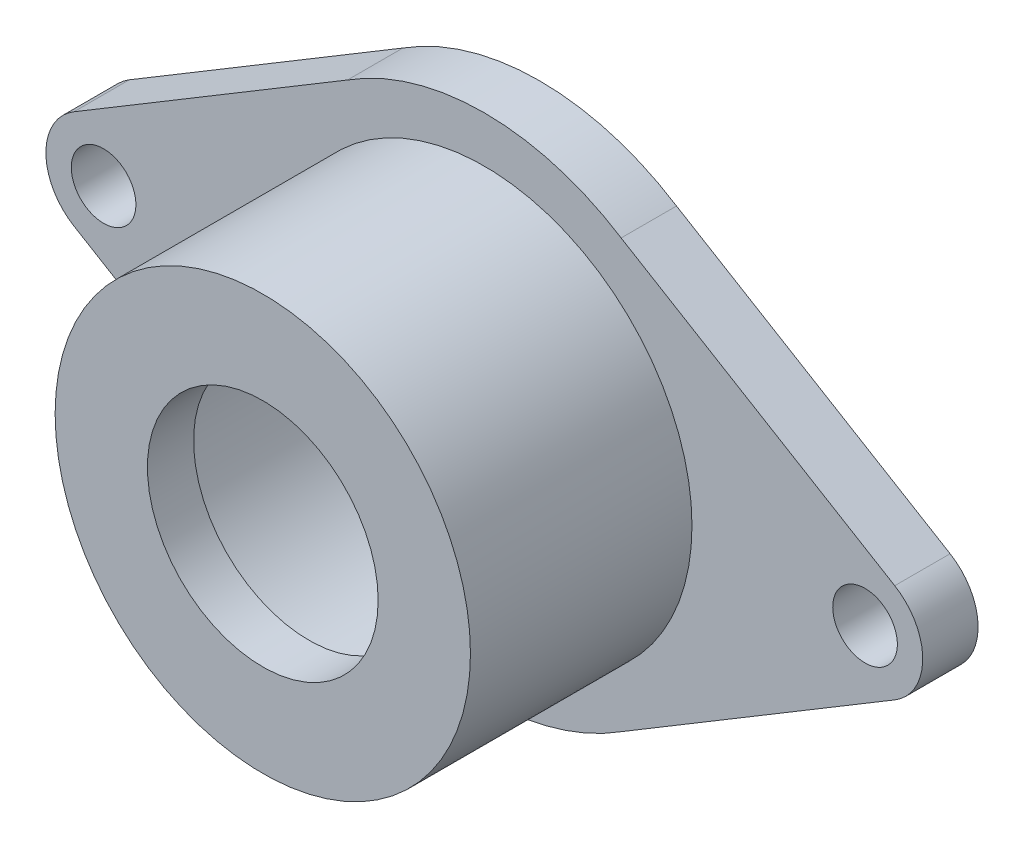
ISO-10303-21;
HEADER;
FILE_DESCRIPTION(('STEP AP214'),'2;1');
FILE_NAME('part.step','',(''),(''),'','','');
FILE_SCHEMA(('AUTOMOTIVE_DESIGN { 1 0 10303 214 1 1 1 1 }'));
ENDSEC;
DATA;
#1=APPLICATION_CONTEXT('core data for automotive mechanical design processes');
#2=APPLICATION_PROTOCOL_DEFINITION('international standard','automotive_design',2000,#1);
#3=PRODUCT_CONTEXT('',#1,'mechanical');
#4=PRODUCT('Part','Part','',(#3));
#5=PRODUCT_RELATED_PRODUCT_CATEGORY('part','',(#4));
#6=PRODUCT_DEFINITION_FORMATION('','',#4);
#7=PRODUCT_DEFINITION_CONTEXT('part definition',#1,'design');
#8=PRODUCT_DEFINITION('design','',#6,#7);
#9=PRODUCT_DEFINITION_SHAPE('','',#8);
#10=(LENGTH_UNIT() NAMED_UNIT(*) SI_UNIT(.MILLI.,.METRE.));
#11=(NAMED_UNIT(*) PLANE_ANGLE_UNIT() SI_UNIT($,.RADIAN.));
#12=(NAMED_UNIT(*) SI_UNIT($,.STERADIAN.) SOLID_ANGLE_UNIT());
#13=UNCERTAINTY_MEASURE_WITH_UNIT(LENGTH_MEASURE(1.E-05),#10,'distance_accuracy_value','');
#14=(GEOMETRIC_REPRESENTATION_CONTEXT(3) GLOBAL_UNCERTAINTY_ASSIGNED_CONTEXT((#13)) GLOBAL_UNIT_ASSIGNED_CONTEXT((#10,
#11,#12)) REPRESENTATION_CONTEXT('',''));
#15=CARTESIAN_POINT('',(0.,0.,0.));
#16=DIRECTION('',(0.,0.,1.));
#17=DIRECTION('',(1.,0.,0.));
#18=AXIS2_PLACEMENT_3D('',#15,#16,#17);
#19=CARTESIAN_POINT('',(0.,-43.5096153846154,119.471153846154));
#20=DIRECTION('',(0.,0.,1.));
#21=DIRECTION('',(1.,0.,0.));
#22=AXIS2_PLACEMENT_3D('',#19,#20,#21);
#23=CYLINDRICAL_SURFACE('',#22,45.);
#24=CARTESIAN_POINT('',(0.,-43.5096153846154,119.471153846154));
#25=DIRECTION('',(0.,0.,1.));
#26=DIRECTION('',(1.,0.,0.));
#27=AXIS2_PLACEMENT_3D('',#24,#25,#26);
#28=CIRCLE('',#27,45.);
#29=CARTESIAN_POINT('',(45.,-43.5096153846154,119.471153846154));
#30=VERTEX_POINT('',#29);
#31=EDGE_CURVE('E177',#30,#30,#28,.T.);
#32=ORIENTED_EDGE('',*,*,#31,.F.);
#33=EDGE_LOOP('',(#32));
#34=FACE_BOUND('',#33,.T.);
#35=CARTESIAN_POINT('',(0.,-43.5096153846154,71.471153846154));
#36=DIRECTION('',(0.,0.,-1.));
#37=DIRECTION('',(-1.,0.,0.));
#38=AXIS2_PLACEMENT_3D('',#35,#36,#37);
#39=CIRCLE('',#38,45.);
#40=CARTESIAN_POINT('',(-45.,-43.5096153846154,71.471153846154));
#41=VERTEX_POINT('',#40);
#42=EDGE_CURVE('E11',#41,#41,#39,.T.);
#43=ORIENTED_EDGE('',*,*,#42,.F.);
#44=EDGE_LOOP('',(#43));
#45=FACE_BOUND('',#44,.T.);
#46=ADVANCED_FACE('F35',(#34,#45),#23,.T.);
#47=CARTESIAN_POINT('',(0.,-43.5096153846154,119.471153846154));
#48=DIRECTION('',(0.,0.,1.));
#49=DIRECTION('',(1.,0.,0.));
#50=AXIS2_PLACEMENT_3D('',#47,#48,#49);
#51=CYLINDRICAL_SURFACE('',#50,35.);
#52=CARTESIAN_POINT('',(0.,-43.5096153846154,59.471153846154));
#53=DIRECTION('',(0.,0.,1.));
#54=DIRECTION('',(1.,0.,0.));
#55=AXIS2_PLACEMENT_3D('',#52,#53,#54);
#56=CIRCLE('',#55,35.);
#57=CARTESIAN_POINT('',(35.,-43.5096153846154,59.471153846154));
#58=VERTEX_POINT('',#57);
#59=EDGE_CURVE('E44',#58,#58,#56,.T.);
#60=ORIENTED_EDGE('',*,*,#59,.F.);
#61=EDGE_LOOP('',(#60));
#62=FACE_BOUND('',#61,.T.);
#63=CARTESIAN_POINT('',(0.,-43.5096153846154,109.471153846154));
#64=DIRECTION('',(0.,0.,1.));
#65=DIRECTION('',(1.,0.,0.));
#66=AXIS2_PLACEMENT_3D('',#63,#64,#65);
#67=CIRCLE('',#66,35.);
#68=CARTESIAN_POINT('',(35.,-43.5096153846154,109.471153846154));
#69=VERTEX_POINT('',#68);
#70=EDGE_CURVE('E159',#69,#69,#67,.T.);
#71=ORIENTED_EDGE('',*,*,#70,.T.);
#72=EDGE_LOOP('',(#71));
#73=FACE_BOUND('',#72,.T.);
#74=ADVANCED_FACE('F37',(#62,#73),#51,.F.);
#75=CARTESIAN_POINT('',(0.,0.,59.471153846154));
#76=DIRECTION('',(0.,0.,1.));
#77=DIRECTION('',(1.,0.,0.));
#78=AXIS2_PLACEMENT_3D('',#75,#76,#77);
#79=PLANE('',#78);
#80=CARTESIAN_POINT('',(82.5000000000336,-43.5096153845629,59.471153846154));
#81=DIRECTION('',(0.,0.,-1.));
#82=DIRECTION('',(-1.,0.,0.));
#83=AXIS2_PLACEMENT_3D('',#80,#81,#82);
#84=CIRCLE('',#83,7.);
#85=CARTESIAN_POINT('',(75.5000000000336,-43.5096153845629,59.471153846154));
#86=VERTEX_POINT('',#85);
#87=EDGE_CURVE('E257',#86,#86,#84,.T.);
#88=ORIENTED_EDGE('',*,*,#87,.F.);
#89=EDGE_LOOP('',(#88));
#90=FACE_BOUND('',#89,.T.);
#91=CARTESIAN_POINT('',(-82.5000000001048,-43.5096153846145,59.471153846154));
#92=DIRECTION('',(0.,0.,-1.));
#93=DIRECTION('',(-1.,0.,0.));
#94=AXIS2_PLACEMENT_3D('',#91,#92,#93);
#95=CIRCLE('',#94,7.);
#96=CARTESIAN_POINT('',(-89.5000000001048,-43.5096153846145,59.471153846154));
#97=VERTEX_POINT('',#96);
#98=EDGE_CURVE('E260',#97,#97,#95,.T.);
#99=ORIENTED_EDGE('',*,*,#98,.F.);
#100=EDGE_LOOP('',(#99));
#101=FACE_BOUND('',#100,.T.);
#102=ORIENTED_EDGE('',*,*,#59,.T.);
#103=EDGE_LOOP('',(#102));
#104=FACE_BOUND('',#103,.T.);
#105=CARTESIAN_POINT('',(0.,-43.5096153846154,59.471153846154));
#106=DIRECTION('',(0.,0.,-1.));
#107=DIRECTION('',(-1.,0.,0.));
#108=AXIS2_PLACEMENT_3D('',#105,#106,#107);
#109=CIRCLE('',#108,55.);
#110=CARTESIAN_POINT('',(29.647715243353,-89.8346947784929,59.471153846154));
#111=VERTEX_POINT('',#110);
#112=CARTESIAN_POINT('',(-29.647715243353,-89.8346947784929,59.471153846154));
#113=VERTEX_POINT('',#112);
#114=EDGE_CURVE('E135',#111,#113,#109,.T.);
#115=ORIENTED_EDGE('',*,*,#114,.T.);
#116=DIRECTION('',(-0.857261085833173,0.514881958040996,0.));
#117=VECTOR('',#116,1.);
#118=CARTESIAN_POINT('',(-29.647715243353,-89.8346947784929,59.471153846154));
#119=LINE('',#118,#117);
#120=CARTESIAN_POINT('',(-88.9360244755942,-54.2253789575528,59.471153846154));
#121=VERTEX_POINT('',#120);
#122=EDGE_CURVE('E138',#113,#121,#119,.T.);
#123=ORIENTED_EDGE('',*,*,#122,.T.);
#124=CARTESIAN_POINT('',(-82.5000000001048,-43.5096153846145,59.471153846154));
#125=DIRECTION('',(0.,0.,-1.));
#126=DIRECTION('',(1.,0.,0.));
#127=AXIS2_PLACEMENT_3D('',#124,#125,#126);
#128=CIRCLE('',#127,12.5000000000084);
#129=CARTESIAN_POINT('',(-88.9360244755493,-32.7938518116483,59.471153846154));
#130=VERTEX_POINT('',#129);
#131=EDGE_CURVE('E142',#121,#130,#128,.T.);
#132=ORIENTED_EDGE('',*,*,#131,.T.);
#133=DIRECTION('',(0.857261085833173,0.514881958040995,0.));
#134=VECTOR('',#133,1.);
#135=CARTESIAN_POINT('',(-29.647715243309,2.81546400929233,59.471153846154));
#136=LINE('',#135,#134);
#137=CARTESIAN_POINT('',(-29.6477152433086,2.81546400929158,59.471153846154));
#138=VERTEX_POINT('',#137);
#139=EDGE_CURVE('E145',#130,#138,#136,.T.);
#140=ORIENTED_EDGE('',*,*,#139,.T.);
#141=CARTESIAN_POINT('',(0.,-43.5096153846154,59.471153846154));
#142=DIRECTION('',(0.,0.,-1.));
#143=DIRECTION('',(-1.,0.,0.));
#144=AXIS2_PLACEMENT_3D('',#141,#142,#143);
#145=CIRCLE('',#144,55.0000000000009);
#146=CARTESIAN_POINT('',(29.6477152433058,2.81546400929232,59.471153846154));
#147=VERTEX_POINT('',#146);
#148=EDGE_CURVE('E148',#138,#147,#145,.T.);
#149=ORIENTED_EDGE('',*,*,#148,.T.);
#150=DIRECTION('',(0.857261085833173,-0.514881958040995,0.));
#151=VECTOR('',#150,1.);
#152=CARTESIAN_POINT('',(29.6477152433058,2.81546400929232,59.471153846154));
#153=LINE('',#152,#151);
#154=CARTESIAN_POINT('',(88.936024475546,-32.7938518116483,59.471153846154));
#155=VERTEX_POINT('',#154);
#156=EDGE_CURVE('E151',#147,#155,#153,.T.);
#157=ORIENTED_EDGE('',*,*,#156,.T.);
#158=CARTESIAN_POINT('',(82.5000000000336,-43.5096153845629,59.471153846154));
#159=DIRECTION('',(0.,0.,-1.));
#160=DIRECTION('',(-1.,0.,0.));
#161=AXIS2_PLACEMENT_3D('',#158,#159,#160);
#162=CIRCLE('',#161,12.5);
#163=CARTESIAN_POINT('',(88.936024475546,-54.2253789574776,59.471153846154));
#164=VERTEX_POINT('',#163);
#165=EDGE_CURVE('E112',#155,#164,#162,.T.);
#166=ORIENTED_EDGE('',*,*,#165,.T.);
#167=DIRECTION('',(-0.857261085832515,-0.514881958042091,0.));
#168=VECTOR('',#167,1.);
#169=CARTESIAN_POINT('',(29.647715243353,-89.8346947784929,59.471153846154));
#170=LINE('',#169,#168);
#171=EDGE_CURVE('E154',#164,#111,#170,.T.);
#172=ORIENTED_EDGE('',*,*,#171,.T.);
#173=EDGE_LOOP('',(#115,#123,#132,#140,#149,#157,#166,#172));
#174=FACE_BOUND('',#173,.T.);
#175=ADVANCED_FACE('F182',(#90,#101,#104,#174),#79,.F.);
#176=CARTESIAN_POINT('',(0.,0.,119.471153846154));
#177=DIRECTION('',(0.,0.,-1.));
#178=DIRECTION('',(-1.,0.,0.));
#179=AXIS2_PLACEMENT_3D('',#176,#177,#178);
#180=PLANE('',#179);
#181=CARTESIAN_POINT('',(0.,-43.5096153846154,119.471153846154));
#182=DIRECTION('',(0.,0.,1.));
#183=DIRECTION('',(1.,0.,0.));
#184=AXIS2_PLACEMENT_3D('',#181,#182,#183);
#185=CIRCLE('',#184,25.);
#186=CARTESIAN_POINT('',(25.,-43.5096153846154,119.471153846154));
#187=VERTEX_POINT('',#186);
#188=EDGE_CURVE('E174',#187,#187,#185,.T.);
#189=ORIENTED_EDGE('',*,*,#188,.F.);
#190=EDGE_LOOP('',(#189));
#191=FACE_BOUND('',#190,.T.);
#192=ORIENTED_EDGE('',*,*,#31,.T.);
#193=EDGE_LOOP('',(#192));
#194=FACE_BOUND('',#193,.T.);
#195=ADVANCED_FACE('F199',(#191,#194),#180,.F.);
#196=CARTESIAN_POINT('',(0.,-43.5096153846154,119.471153846154));
#197=DIRECTION('',(0.,0.,1.));
#198=DIRECTION('',(1.,0.,0.));
#199=AXIS2_PLACEMENT_3D('',#196,#197,#198);
#200=CYLINDRICAL_SURFACE('',#199,25.);
#201=CARTESIAN_POINT('',(0.,-43.5096153846154,109.471153846154));
#202=DIRECTION('',(0.,0.,1.));
#203=DIRECTION('',(1.,0.,0.));
#204=AXIS2_PLACEMENT_3D('',#201,#202,#203);
#205=CIRCLE('',#204,25.);
#206=CARTESIAN_POINT('',(25.,-43.5096153846154,109.471153846154));
#207=VERTEX_POINT('',#206);
#208=EDGE_CURVE('E171',#207,#207,#205,.T.);
#209=ORIENTED_EDGE('',*,*,#208,.F.);
#210=EDGE_LOOP('',(#209));
#211=FACE_BOUND('',#210,.T.);
#212=ORIENTED_EDGE('',*,*,#188,.T.);
#213=EDGE_LOOP('',(#212));
#214=FACE_BOUND('',#213,.T.);
#215=ADVANCED_FACE('F193',(#211,#214),#200,.F.);
#216=CARTESIAN_POINT('',(0.,0.,109.471153846154));
#217=DIRECTION('',(0.,0.,1.));
#218=DIRECTION('',(1.,0.,0.));
#219=AXIS2_PLACEMENT_3D('',#216,#217,#218);
#220=PLANE('',#219);
#221=ORIENTED_EDGE('',*,*,#70,.F.);
#222=EDGE_LOOP('',(#221));
#223=FACE_BOUND('',#222,.T.);
#224=ORIENTED_EDGE('',*,*,#208,.T.);
#225=EDGE_LOOP('',(#224));
#226=FACE_BOUND('',#225,.T.);
#227=ADVANCED_FACE('F189',(#223,#226),#220,.F.);
#228=CARTESIAN_POINT('',(0.,-43.5096153846154,71.471153846154));
#229=DIRECTION('',(0.,0.,-1.));
#230=DIRECTION('',(-1.,0.,0.));
#231=AXIS2_PLACEMENT_3D('',#228,#229,#230);
#232=CYLINDRICAL_SURFACE('',#231,55.);
#233=ORIENTED_EDGE('',*,*,#114,.F.);
#234=DIRECTION('',(0.,0.,-1.));
#235=VECTOR('',#234,1.);
#236=CARTESIAN_POINT('',(29.647715243353,-89.8346947784929,71.471153846154));
#237=LINE('',#236,#235);
#238=CARTESIAN_POINT('',(29.647715243353,-89.8346947784929,71.471153846154));
#239=VERTEX_POINT('',#238);
#240=EDGE_CURVE('E52',#239,#111,#237,.T.);
#241=ORIENTED_EDGE('',*,*,#240,.F.);
#242=CARTESIAN_POINT('',(0.,-43.5096153846154,71.471153846154));
#243=DIRECTION('',(0.,0.,-1.));
#244=DIRECTION('',(-1.,0.,0.));
#245=AXIS2_PLACEMENT_3D('',#242,#243,#244);
#246=CIRCLE('',#245,55.);
#247=CARTESIAN_POINT('',(-29.647715243353,-89.8346947784929,71.471153846154));
#248=VERTEX_POINT('',#247);
#249=EDGE_CURVE('E157',#239,#248,#246,.T.);
#250=ORIENTED_EDGE('',*,*,#249,.T.);
#251=DIRECTION('',(0.,0.,-1.));
#252=VECTOR('',#251,1.);
#253=CARTESIAN_POINT('',(-29.647715243353,-89.8346947784929,71.471153846154));
#254=LINE('',#253,#252);
#255=EDGE_CURVE('E93',#248,#113,#254,.T.);
#256=ORIENTED_EDGE('',*,*,#255,.T.);
#257=EDGE_LOOP('',(#233,#241,#250,#256));
#258=FACE_BOUND('',#257,.T.);
#259=ADVANCED_FACE('F192',(#258),#232,.T.);
#260=CARTESIAN_POINT('',(29.647715243353,-89.8346947784929,71.471153846154));
#261=DIRECTION('',(0.514881958042091,-0.857261085832515,0.));
#262=DIRECTION('',(0.857261085832515,0.514881958042091,0.));
#263=AXIS2_PLACEMENT_3D('',#260,#261,#262);
#264=PLANE('',#263);
#265=ORIENTED_EDGE('',*,*,#171,.F.);
#266=DIRECTION('',(0.,0.,-1.));
#267=VECTOR('',#266,1.);
#268=CARTESIAN_POINT('',(88.936024475546,-54.2253789574776,71.471153846154));
#269=LINE('',#268,#267);
#270=CARTESIAN_POINT('',(88.936024475546,-54.2253789574776,71.471153846154));
#271=VERTEX_POINT('',#270);
#272=EDGE_CURVE('E81',#271,#164,#269,.T.);
#273=ORIENTED_EDGE('',*,*,#272,.F.);
#274=DIRECTION('',(-0.857261085832515,-0.514881958042091,0.));
#275=VECTOR('',#274,1.);
#276=CARTESIAN_POINT('',(29.647715243353,-89.8346947784929,71.471153846154));
#277=LINE('',#276,#275);
#278=EDGE_CURVE('E125',#271,#239,#277,.T.);
#279=ORIENTED_EDGE('',*,*,#278,.T.);
#280=ORIENTED_EDGE('',*,*,#240,.T.);
#281=EDGE_LOOP('',(#265,#273,#279,#280));
#282=FACE_BOUND('',#281,.T.);
#283=ADVANCED_FACE('F231',(#282),#264,.T.);
#284=CARTESIAN_POINT('',(82.5000000000336,-43.5096153845629,71.471153846154));
#285=DIRECTION('',(0.,0.,-1.));
#286=DIRECTION('',(-1.,0.,0.));
#287=AXIS2_PLACEMENT_3D('',#284,#285,#286);
#288=CYLINDRICAL_SURFACE('',#287,12.5);
#289=ORIENTED_EDGE('',*,*,#165,.F.);
#290=DIRECTION('',(0.,0.,-1.));
#291=VECTOR('',#290,1.);
#292=CARTESIAN_POINT('',(88.936024475546,-32.7938518116483,71.471153846154));
#293=LINE('',#292,#291);
#294=CARTESIAN_POINT('',(88.936024475546,-32.7938518116483,71.471153846154));
#295=VERTEX_POINT('',#294);
#296=EDGE_CURVE('E107',#295,#155,#293,.T.);
#297=ORIENTED_EDGE('',*,*,#296,.F.);
#298=CARTESIAN_POINT('',(82.5000000000336,-43.5096153845629,71.471153846154));
#299=DIRECTION('',(0.,0.,-1.));
#300=DIRECTION('',(-1.,0.,0.));
#301=AXIS2_PLACEMENT_3D('',#298,#299,#300);
#302=CIRCLE('',#301,12.5);
#303=EDGE_CURVE('E110',#295,#271,#302,.T.);
#304=ORIENTED_EDGE('',*,*,#303,.T.);
#305=ORIENTED_EDGE('',*,*,#272,.T.);
#306=EDGE_LOOP('',(#289,#297,#304,#305));
#307=FACE_BOUND('',#306,.T.);
#308=ADVANCED_FACE('F109',(#307),#288,.T.);
#309=CARTESIAN_POINT('',(29.6477152433058,2.81546400929232,71.471153846154));
#310=DIRECTION('',(0.514881958040995,0.857261085833173,0.));
#311=DIRECTION('',(-0.857261085833173,0.514881958040995,0.));
#312=AXIS2_PLACEMENT_3D('',#309,#310,#311);
#313=PLANE('',#312);
#314=ORIENTED_EDGE('',*,*,#156,.F.);
#315=DIRECTION('',(0.,0.,-1.));
#316=VECTOR('',#315,1.);
#317=CARTESIAN_POINT('',(29.6477152433058,2.81546400929232,71.471153846154));
#318=LINE('',#317,#316);
#319=CARTESIAN_POINT('',(29.6477152433058,2.81546400929232,71.471153846154));
#320=VERTEX_POINT('',#319);
#321=EDGE_CURVE('E117',#320,#147,#318,.T.);
#322=ORIENTED_EDGE('',*,*,#321,.F.);
#323=DIRECTION('',(0.857261085833173,-0.514881958040995,0.));
#324=VECTOR('',#323,1.);
#325=CARTESIAN_POINT('',(29.6477152433058,2.81546400929232,71.471153846154));
#326=LINE('',#325,#324);
#327=EDGE_CURVE('E123',#320,#295,#326,.T.);
#328=ORIENTED_EDGE('',*,*,#327,.T.);
#329=ORIENTED_EDGE('',*,*,#296,.T.);
#330=EDGE_LOOP('',(#314,#322,#328,#329));
#331=FACE_BOUND('',#330,.T.);
#332=ADVANCED_FACE('F127',(#331),#313,.T.);
#333=CARTESIAN_POINT('',(0.,-43.5096153846154,71.471153846154));
#334=DIRECTION('',(0.,0.,-1.));
#335=DIRECTION('',(-1.,0.,0.));
#336=AXIS2_PLACEMENT_3D('',#333,#334,#335);
#337=CYLINDRICAL_SURFACE('',#336,55.0000000000009);
#338=ORIENTED_EDGE('',*,*,#148,.F.);
#339=DIRECTION('',(0.,0.,-1.));
#340=VECTOR('',#339,1.);
#341=CARTESIAN_POINT('',(-29.6477152433086,2.81546400929158,71.471153846154));
#342=LINE('',#341,#340);
#343=CARTESIAN_POINT('',(-29.6477152433086,2.81546400929158,71.471153846154));
#344=VERTEX_POINT('',#343);
#345=EDGE_CURVE('E162',#344,#138,#342,.T.);
#346=ORIENTED_EDGE('',*,*,#345,.F.);
#347=CARTESIAN_POINT('',(0.,-43.5096153846154,71.471153846154));
#348=DIRECTION('',(0.,0.,-1.));
#349=DIRECTION('',(-1.,0.,0.));
#350=AXIS2_PLACEMENT_3D('',#347,#348,#349);
#351=CIRCLE('',#350,55.0000000000009);
#352=EDGE_CURVE('E128',#344,#320,#351,.T.);
#353=ORIENTED_EDGE('',*,*,#352,.T.);
#354=ORIENTED_EDGE('',*,*,#321,.T.);
#355=EDGE_LOOP('',(#338,#346,#353,#354));
#356=FACE_BOUND('',#355,.T.);
#357=ADVANCED_FACE('F238',(#356),#337,.T.);
#358=CARTESIAN_POINT('',(-29.647715243309,2.81546400929233,71.471153846154));
#359=DIRECTION('',(-0.514881958040995,0.857261085833173,0.));
#360=DIRECTION('',(-0.857261085833173,-0.514881958040995,0.));
#361=AXIS2_PLACEMENT_3D('',#358,#359,#360);
#362=PLANE('',#361);
#363=ORIENTED_EDGE('',*,*,#139,.F.);
#364=DIRECTION('',(0.,0.,-1.));
#365=VECTOR('',#364,1.);
#366=CARTESIAN_POINT('',(-88.9360244755493,-32.7938518116483,71.471153846154));
#367=LINE('',#366,#365);
#368=CARTESIAN_POINT('',(-88.9360244755493,-32.7938518116483,71.471153846154));
#369=VERTEX_POINT('',#368);
#370=EDGE_CURVE('E164',#369,#130,#367,.T.);
#371=ORIENTED_EDGE('',*,*,#370,.F.);
#372=DIRECTION('',(0.857261085833173,0.514881958040995,0.));
#373=VECTOR('',#372,1.);
#374=CARTESIAN_POINT('',(-29.647715243309,2.81546400929233,71.471153846154));
#375=LINE('',#374,#373);
#376=EDGE_CURVE('E130',#369,#344,#375,.T.);
#377=ORIENTED_EDGE('',*,*,#376,.T.);
#378=ORIENTED_EDGE('',*,*,#345,.T.);
#379=EDGE_LOOP('',(#363,#371,#377,#378));
#380=FACE_BOUND('',#379,.T.);
#381=ADVANCED_FACE('F241',(#380),#362,.T.);
#382=CARTESIAN_POINT('',(-82.5000000001048,-43.5096153846145,71.471153846154));
#383=DIRECTION('',(0.,0.,-1.));
#384=DIRECTION('',(-1.,0.,0.));
#385=AXIS2_PLACEMENT_3D('',#382,#383,#384);
#386=CYLINDRICAL_SURFACE('',#385,12.5000000000084);
#387=ORIENTED_EDGE('',*,*,#131,.F.);
#388=DIRECTION('',(0.,0.,-1.));
#389=VECTOR('',#388,1.);
#390=CARTESIAN_POINT('',(-88.9360244755942,-54.2253789575528,71.471153846154));
#391=LINE('',#390,#389);
#392=CARTESIAN_POINT('',(-88.9360244755942,-54.2253789575528,71.471153846154));
#393=VERTEX_POINT('',#392);
#394=EDGE_CURVE('E166',#393,#121,#391,.T.);
#395=ORIENTED_EDGE('',*,*,#394,.F.);
#396=CARTESIAN_POINT('',(-82.5000000001048,-43.5096153846145,71.471153846154));
#397=DIRECTION('',(0.,0.,-1.));
#398=DIRECTION('',(1.,0.,0.));
#399=AXIS2_PLACEMENT_3D('',#396,#397,#398);
#400=CIRCLE('',#399,12.5000000000084);
#401=EDGE_CURVE('E271',#393,#369,#400,.T.);
#402=ORIENTED_EDGE('',*,*,#401,.T.);
#403=ORIENTED_EDGE('',*,*,#370,.T.);
#404=EDGE_LOOP('',(#387,#395,#402,#403));
#405=FACE_BOUND('',#404,.T.);
#406=ADVANCED_FACE('F225',(#405),#386,.T.);
#407=CARTESIAN_POINT('',(-29.647715243353,-89.8346947784929,71.471153846154));
#408=DIRECTION('',(-0.514881958040996,-0.857261085833173,0.));
#409=DIRECTION('',(0.857261085833173,-0.514881958040996,0.));
#410=AXIS2_PLACEMENT_3D('',#407,#408,#409);
#411=PLANE('',#410);
#412=ORIENTED_EDGE('',*,*,#122,.F.);
#413=ORIENTED_EDGE('',*,*,#255,.F.);
#414=DIRECTION('',(-0.857261085833173,0.514881958040996,0.));
#415=VECTOR('',#414,1.);
#416=CARTESIAN_POINT('',(-29.647715243353,-89.8346947784929,71.471153846154));
#417=LINE('',#416,#415);
#418=EDGE_CURVE('E269',#248,#393,#417,.T.);
#419=ORIENTED_EDGE('',*,*,#418,.T.);
#420=ORIENTED_EDGE('',*,*,#394,.T.);
#421=EDGE_LOOP('',(#412,#413,#419,#420));
#422=FACE_BOUND('',#421,.T.);
#423=ADVANCED_FACE('F215',(#422),#411,.T.);
#424=CARTESIAN_POINT('',(0.,-43.5096153846154,71.471153846154));
#425=DIRECTION('',(0.,0.,-1.));
#426=DIRECTION('',(-1.,0.,0.));
#427=AXIS2_PLACEMENT_3D('',#424,#425,#426);
#428=PLANE('',#427);
#429=CARTESIAN_POINT('',(82.5000000000336,-43.5096153845629,71.471153846154));
#430=DIRECTION('',(0.,0.,-1.));
#431=DIRECTION('',(-1.,0.,0.));
#432=AXIS2_PLACEMENT_3D('',#429,#430,#431);
#433=CIRCLE('',#432,7.);
#434=CARTESIAN_POINT('',(75.5000000000336,-43.5096153845629,71.471153846154));
#435=VERTEX_POINT('',#434);
#436=EDGE_CURVE('E139',#435,#435,#433,.T.);
#437=ORIENTED_EDGE('',*,*,#436,.T.);
#438=EDGE_LOOP('',(#437));
#439=FACE_BOUND('',#438,.T.);
#440=CARTESIAN_POINT('',(-82.5000000001048,-43.5096153846145,71.471153846154));
#441=DIRECTION('',(0.,0.,-1.));
#442=DIRECTION('',(-1.,0.,0.));
#443=AXIS2_PLACEMENT_3D('',#440,#441,#442);
#444=CIRCLE('',#443,7.);
#445=CARTESIAN_POINT('',(-89.5000000001048,-43.5096153846145,71.471153846154));
#446=VERTEX_POINT('',#445);
#447=EDGE_CURVE('E262',#446,#446,#444,.T.);
#448=ORIENTED_EDGE('',*,*,#447,.T.);
#449=EDGE_LOOP('',(#448));
#450=FACE_BOUND('',#449,.T.);
#451=ORIENTED_EDGE('',*,*,#42,.T.);
#452=EDGE_LOOP('',(#451));
#453=FACE_BOUND('',#452,.T.);
#454=ORIENTED_EDGE('',*,*,#249,.F.);
#455=ORIENTED_EDGE('',*,*,#278,.F.);
#456=ORIENTED_EDGE('',*,*,#303,.F.);
#457=ORIENTED_EDGE('',*,*,#327,.F.);
#458=ORIENTED_EDGE('',*,*,#352,.F.);
#459=ORIENTED_EDGE('',*,*,#376,.F.);
#460=ORIENTED_EDGE('',*,*,#401,.F.);
#461=ORIENTED_EDGE('',*,*,#418,.F.);
#462=EDGE_LOOP('',(#454,#455,#456,#457,#458,#459,#460,#461));
#463=FACE_BOUND('',#462,.T.);
#464=ADVANCED_FACE('F121',(#439,#450,#453,#463),#428,.F.);
#465=CARTESIAN_POINT('',(-82.5000000001048,-43.5096153846145,71.471153846154));
#466=DIRECTION('',(0.,0.,-1.));
#467=DIRECTION('',(-1.,0.,0.));
#468=AXIS2_PLACEMENT_3D('',#465,#466,#467);
#469=CYLINDRICAL_SURFACE('',#468,7.);
#470=ORIENTED_EDGE('',*,*,#447,.F.);
#471=EDGE_LOOP('',(#470));
#472=FACE_BOUND('',#471,.T.);
#473=ORIENTED_EDGE('',*,*,#98,.T.);
#474=EDGE_LOOP('',(#473));
#475=FACE_BOUND('',#474,.T.);
#476=ADVANCED_FACE('F214',(#472,#475),#469,.F.);
#477=CARTESIAN_POINT('',(82.5000000000336,-43.5096153845629,71.471153846154));
#478=DIRECTION('',(0.,0.,-1.));
#479=DIRECTION('',(-1.,0.,0.));
#480=AXIS2_PLACEMENT_3D('',#477,#478,#479);
#481=CYLINDRICAL_SURFACE('',#480,7.);
#482=ORIENTED_EDGE('',*,*,#436,.F.);
#483=EDGE_LOOP('',(#482));
#484=FACE_BOUND('',#483,.T.);
#485=ORIENTED_EDGE('',*,*,#87,.T.);
#486=EDGE_LOOP('',(#485));
#487=FACE_BOUND('',#486,.T.);
#488=ADVANCED_FACE('F222',(#484,#487),#481,.F.);
#489=CLOSED_SHELL('',(#46,#74,#175,#195,#215,#227,#259,#283,#308,#332,#357,#381,#406,#423,#464,
#476,#488));
#490=MANIFOLD_SOLID_BREP('B2',#489);
#491=ADVANCED_BREP_SHAPE_REPRESENTATION('',(#18,#490),#14);
#492=SHAPE_DEFINITION_REPRESENTATION(#9,#491);
ENDSEC;
END-ISO-10303-21;
